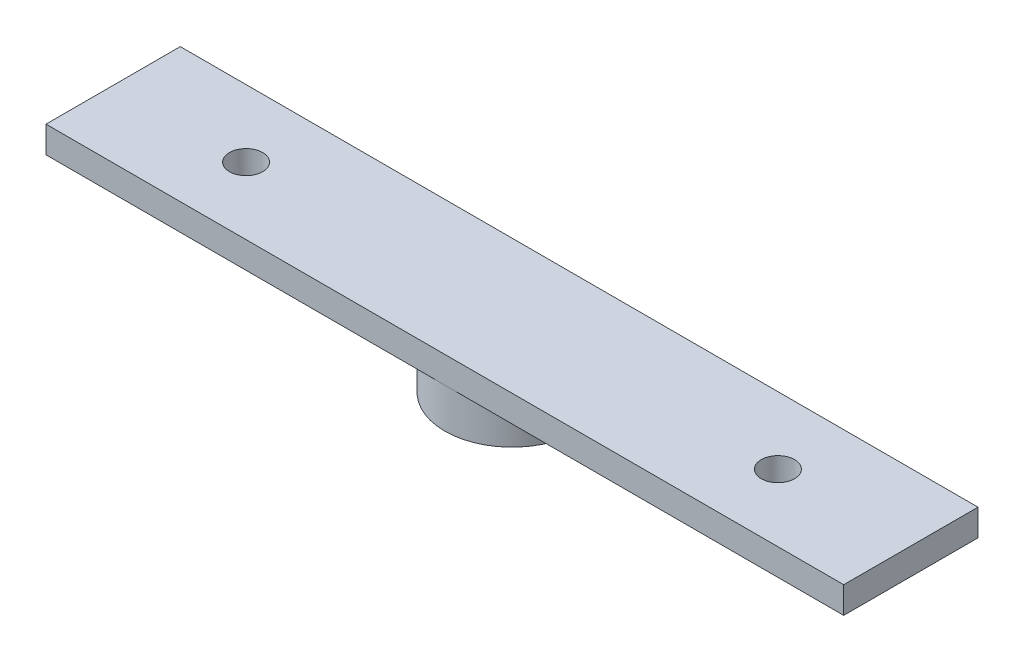
ISO-10303-21;
HEADER;
FILE_DESCRIPTION(('STEP AP214'),'2;1');
FILE_NAME('part.step','',(''),(''),'','','');
FILE_SCHEMA(('AUTOMOTIVE_DESIGN { 1 0 10303 214 1 1 1 1 }'));
ENDSEC;
DATA;
#1=APPLICATION_CONTEXT('core data for automotive mechanical design processes');
#2=APPLICATION_PROTOCOL_DEFINITION('international standard','automotive_design',2000,#1);
#3=PRODUCT_CONTEXT('',#1,'mechanical');
#4=PRODUCT('Part','Part','',(#3));
#5=PRODUCT_RELATED_PRODUCT_CATEGORY('part','',(#4));
#6=PRODUCT_DEFINITION_FORMATION('','',#4);
#7=PRODUCT_DEFINITION_CONTEXT('part definition',#1,'design');
#8=PRODUCT_DEFINITION('design','',#6,#7);
#9=PRODUCT_DEFINITION_SHAPE('','',#8);
#10=(LENGTH_UNIT() NAMED_UNIT(*) SI_UNIT(.MILLI.,.METRE.));
#11=(NAMED_UNIT(*) PLANE_ANGLE_UNIT() SI_UNIT($,.RADIAN.));
#12=(NAMED_UNIT(*) SI_UNIT($,.STERADIAN.) SOLID_ANGLE_UNIT());
#13=UNCERTAINTY_MEASURE_WITH_UNIT(LENGTH_MEASURE(1.E-05),#10,'distance_accuracy_value','');
#14=(GEOMETRIC_REPRESENTATION_CONTEXT(3) GLOBAL_UNCERTAINTY_ASSIGNED_CONTEXT((#13)) GLOBAL_UNIT_ASSIGNED_CONTEXT((#10,
#11,#12)) REPRESENTATION_CONTEXT('',''));
#15=CARTESIAN_POINT('',(0.,0.,0.));
#16=DIRECTION('',(0.,0.,1.));
#17=DIRECTION('',(1.,0.,0.));
#18=AXIS2_PLACEMENT_3D('',#15,#16,#17);
#19=CARTESIAN_POINT('',(5.05,0.,0.));
#20=DIRECTION('',(0.,1.,0.));
#21=DIRECTION('',(0.,0.,1.));
#22=AXIS2_PLACEMENT_3D('',#19,#20,#21);
#23=PLANE('',#22);
#24=CARTESIAN_POINT('',(0.,0.,0.));
#25=DIRECTION('',(0.,1.,0.));
#26=DIRECTION('',(0.,0.,1.));
#27=AXIS2_PLACEMENT_3D('',#24,#25,#26);
#28=CIRCLE('',#27,5.05);
#29=CARTESIAN_POINT('',(0.,0.,5.05));
#30=VERTEX_POINT('',#29);
#31=EDGE_CURVE('E109',#30,#30,#28,.T.);
#32=ORIENTED_EDGE('',*,*,#31,.F.);
#33=EDGE_LOOP('',(#32));
#34=FACE_BOUND('',#33,.T.);
#35=CARTESIAN_POINT('',(0.,0.,0.));
#36=DIRECTION('',(0.,1.,0.));
#37=DIRECTION('',(0.,0.,1.));
#38=AXIS2_PLACEMENT_3D('',#35,#36,#37);
#39=CIRCLE('',#38,3.05);
#40=CARTESIAN_POINT('',(0.,0.,3.05));
#41=VERTEX_POINT('',#40);
#42=EDGE_CURVE('E11',#41,#41,#39,.T.);
#43=ORIENTED_EDGE('',*,*,#42,.T.);
#44=EDGE_LOOP('',(#43));
#45=FACE_BOUND('',#44,.T.);
#46=ADVANCED_FACE('F37',(#34,#45),#23,.F.);
#47=CARTESIAN_POINT('',(0.,97.022326023357,0.));
#48=DIRECTION('',(0.,1.,0.));
#49=DIRECTION('',(0.,0.,1.));
#50=AXIS2_PLACEMENT_3D('',#47,#48,#49);
#51=CYLINDRICAL_SURFACE('',#50,3.05);
#52=ORIENTED_EDGE('',*,*,#42,.F.);
#53=EDGE_LOOP('',(#52));
#54=FACE_BOUND('',#53,.T.);
#55=CARTESIAN_POINT('',(0.,3.,0.));
#56=DIRECTION('',(0.,1.,0.));
#57=DIRECTION('',(0.,0.,1.));
#58=AXIS2_PLACEMENT_3D('',#55,#56,#57);
#59=CIRCLE('',#58,3.05);
#60=CARTESIAN_POINT('',(0.,3.,3.05));
#61=VERTEX_POINT('',#60);
#62=EDGE_CURVE('E106',#61,#61,#59,.T.);
#63=ORIENTED_EDGE('',*,*,#62,.T.);
#64=EDGE_LOOP('',(#63));
#65=FACE_BOUND('',#64,.T.);
#66=ADVANCED_FACE('F154',(#54,#65),#51,.F.);
#67=CARTESIAN_POINT('',(0.,97.022326023357,0.));
#68=DIRECTION('',(0.,1.,0.));
#69=DIRECTION('',(0.,0.,1.));
#70=AXIS2_PLACEMENT_3D('',#67,#68,#69);
#71=CYLINDRICAL_SURFACE('',#70,5.05);
#72=CARTESIAN_POINT('',(0.,3.,0.));
#73=DIRECTION('',(0.,1.,0.));
#74=DIRECTION('',(0.,0.,1.));
#75=AXIS2_PLACEMENT_3D('',#72,#73,#74);
#76=CIRCLE('',#75,5.05);
#77=CARTESIAN_POINT('',(0.,3.,5.05));
#78=VERTEX_POINT('',#77);
#79=CARTESIAN_POINT('',(0.,3.,-5.05));
#80=VERTEX_POINT('',#79);
#81=EDGE_CURVE('E45',#78,#80,#76,.T.);
#82=ORIENTED_EDGE('',*,*,#81,.F.);
#83=EDGE_CURVE('E51',#80,#78,#76,.T.);
#84=ORIENTED_EDGE('',*,*,#83,.F.);
#85=EDGE_LOOP('',(#82,#84));
#86=FACE_BOUND('',#85,.T.);
#87=ORIENTED_EDGE('',*,*,#31,.T.);
#88=EDGE_LOOP('',(#87));
#89=FACE_BOUND('',#88,.T.);
#90=ADVANCED_FACE('F159',(#86,#89),#71,.T.);
#91=CARTESIAN_POINT('',(0.,3.,0.));
#92=DIRECTION('',(0.,-1.,0.));
#93=DIRECTION('',(0.,0.,-1.));
#94=AXIS2_PLACEMENT_3D('',#91,#92,#93);
#95=PLANE('',#94);
#96=CARTESIAN_POINT('',(-20.,3.,0.));
#97=DIRECTION('',(0.,-1.,0.));
#98=DIRECTION('',(0.,0.,-1.));
#99=AXIS2_PLACEMENT_3D('',#96,#97,#98);
#100=CIRCLE('',#99,1.25);
#101=CARTESIAN_POINT('',(-20.,3.,-1.25));
#102=VERTEX_POINT('',#101);
#103=EDGE_CURVE('E141',#102,#102,#100,.T.);
#104=ORIENTED_EDGE('',*,*,#103,.F.);
#105=EDGE_LOOP('',(#104));
#106=FACE_BOUND('',#105,.T.);
#107=DIRECTION('',(-1.,0.,0.));
#108=VECTOR('',#107,1.);
#109=CARTESIAN_POINT('',(-30.,3.,-5.05));
#110=LINE('',#109,#108);
#111=CARTESIAN_POINT('',(-30.,3.,-5.05));
#112=VERTEX_POINT('',#111);
#113=EDGE_CURVE('E125',#80,#112,#110,.T.);
#114=ORIENTED_EDGE('',*,*,#113,.F.);
#115=ORIENTED_EDGE('',*,*,#83,.T.);
#116=DIRECTION('',(1.,0.,0.));
#117=VECTOR('',#116,1.);
#118=CARTESIAN_POINT('',(-30.,3.,5.05));
#119=LINE('',#118,#117);
#120=CARTESIAN_POINT('',(-30.,3.,5.05));
#121=VERTEX_POINT('',#120);
#122=EDGE_CURVE('E101',#121,#78,#119,.T.);
#123=ORIENTED_EDGE('',*,*,#122,.F.);
#124=DIRECTION('',(0.,0.,1.));
#125=VECTOR('',#124,1.);
#126=CARTESIAN_POINT('',(-30.,3.,5.05));
#127=LINE('',#126,#125);
#128=EDGE_CURVE('E129',#112,#121,#127,.T.);
#129=ORIENTED_EDGE('',*,*,#128,.F.);
#130=EDGE_LOOP('',(#114,#115,#123,#129));
#131=FACE_BOUND('',#130,.T.);
#132=ADVANCED_FACE('F122',(#106,#131),#95,.T.);
#133=CARTESIAN_POINT('',(0.,5.,0.));
#134=DIRECTION('',(0.,-1.,0.));
#135=DIRECTION('',(0.,0.,-1.));
#136=AXIS2_PLACEMENT_3D('',#133,#134,#135);
#137=PLANE('',#136);
#138=CARTESIAN_POINT('',(-20.,5.,0.));
#139=DIRECTION('',(0.,1.,0.));
#140=DIRECTION('',(0.,0.,1.));
#141=AXIS2_PLACEMENT_3D('',#138,#139,#140);
#142=CIRCLE('',#141,1.25);
#143=CARTESIAN_POINT('',(-20.,5.,1.25));
#144=VERTEX_POINT('',#143);
#145=EDGE_CURVE('E193',#144,#144,#142,.T.);
#146=ORIENTED_EDGE('',*,*,#145,.F.);
#147=EDGE_LOOP('',(#146));
#148=FACE_BOUND('',#147,.T.);
#149=CARTESIAN_POINT('',(20.,5.,0.));
#150=DIRECTION('',(0.,1.,0.));
#151=DIRECTION('',(0.,0.,-1.));
#152=AXIS2_PLACEMENT_3D('',#149,#150,#151);
#153=CIRCLE('',#152,1.25);
#154=CARTESIAN_POINT('',(20.,5.,-1.25));
#155=VERTEX_POINT('',#154);
#156=EDGE_CURVE('E195',#155,#155,#153,.T.);
#157=ORIENTED_EDGE('',*,*,#156,.F.);
#158=EDGE_LOOP('',(#157));
#159=FACE_BOUND('',#158,.T.);
#160=DIRECTION('',(0.,0.,-1.));
#161=VECTOR('',#160,1.);
#162=CARTESIAN_POINT('',(30.,5.,5.05));
#163=LINE('',#162,#161);
#164=CARTESIAN_POINT('',(30.,5.,5.05));
#165=VERTEX_POINT('',#164);
#166=CARTESIAN_POINT('',(30.,5.,-5.05));
#167=VERTEX_POINT('',#166);
#168=EDGE_CURVE('E92',#165,#167,#163,.T.);
#169=ORIENTED_EDGE('',*,*,#168,.T.);
#170=DIRECTION('',(-1.,0.,0.));
#171=VECTOR('',#170,1.);
#172=CARTESIAN_POINT('',(-30.,5.,-5.05));
#173=LINE('',#172,#171);
#174=CARTESIAN_POINT('',(-30.,5.,-5.05));
#175=VERTEX_POINT('',#174);
#176=EDGE_CURVE('E80',#167,#175,#173,.T.);
#177=ORIENTED_EDGE('',*,*,#176,.T.);
#178=DIRECTION('',(0.,0.,1.));
#179=VECTOR('',#178,1.);
#180=CARTESIAN_POINT('',(-30.,5.,5.05));
#181=LINE('',#180,#179);
#182=CARTESIAN_POINT('',(-30.,5.,5.05));
#183=VERTEX_POINT('',#182);
#184=EDGE_CURVE('E91',#175,#183,#181,.T.);
#185=ORIENTED_EDGE('',*,*,#184,.T.);
#186=DIRECTION('',(1.,0.,0.));
#187=VECTOR('',#186,1.);
#188=CARTESIAN_POINT('',(-30.,5.,5.05));
#189=LINE('',#188,#187);
#190=EDGE_CURVE('E97',#183,#165,#189,.T.);
#191=ORIENTED_EDGE('',*,*,#190,.T.);
#192=EDGE_LOOP('',(#169,#177,#185,#191));
#193=FACE_BOUND('',#192,.T.);
#194=ADVANCED_FACE('F95',(#148,#159,#193),#137,.F.);
#195=CARTESIAN_POINT('',(-30.,5.,5.05));
#196=DIRECTION('',(0.,0.,-1.));
#197=DIRECTION('',(-1.,0.,0.));
#198=AXIS2_PLACEMENT_3D('',#195,#196,#197);
#199=PLANE('',#198);
#200=ORIENTED_EDGE('',*,*,#122,.T.);
#201=CARTESIAN_POINT('',(30.,3.,5.05));
#202=VERTEX_POINT('',#201);
#203=EDGE_CURVE('E126',#78,#202,#119,.T.);
#204=ORIENTED_EDGE('',*,*,#203,.T.);
#205=DIRECTION('',(0.,-1.,0.));
#206=VECTOR('',#205,1.);
#207=CARTESIAN_POINT('',(30.,5.,5.05));
#208=LINE('',#207,#206);
#209=EDGE_CURVE('E137',#165,#202,#208,.T.);
#210=ORIENTED_EDGE('',*,*,#209,.F.);
#211=ORIENTED_EDGE('',*,*,#190,.F.);
#212=DIRECTION('',(0.,-1.,0.));
#213=VECTOR('',#212,1.);
#214=CARTESIAN_POINT('',(-30.,5.,5.05));
#215=LINE('',#214,#213);
#216=EDGE_CURVE('E111',#183,#121,#215,.T.);
#217=ORIENTED_EDGE('',*,*,#216,.T.);
#218=EDGE_LOOP('',(#200,#204,#210,#211,#217));
#219=FACE_BOUND('',#218,.T.);
#220=ADVANCED_FACE('F132',(#219),#199,.F.);
#221=CARTESIAN_POINT('',(-30.,5.,5.05));
#222=DIRECTION('',(1.,0.,0.));
#223=DIRECTION('',(0.,0.,-1.));
#224=AXIS2_PLACEMENT_3D('',#221,#222,#223);
#225=PLANE('',#224);
#226=ORIENTED_EDGE('',*,*,#128,.T.);
#227=ORIENTED_EDGE('',*,*,#216,.F.);
#228=ORIENTED_EDGE('',*,*,#184,.F.);
#229=DIRECTION('',(0.,-1.,0.));
#230=VECTOR('',#229,1.);
#231=CARTESIAN_POINT('',(-30.,5.,-5.05));
#232=LINE('',#231,#230);
#233=EDGE_CURVE('E88',#175,#112,#232,.T.);
#234=ORIENTED_EDGE('',*,*,#233,.T.);
#235=EDGE_LOOP('',(#226,#227,#228,#234));
#236=FACE_BOUND('',#235,.T.);
#237=ADVANCED_FACE('F144',(#236),#225,.F.);
#238=CARTESIAN_POINT('',(-30.,5.,-5.05));
#239=DIRECTION('',(0.,0.,1.));
#240=DIRECTION('',(1.,0.,0.));
#241=AXIS2_PLACEMENT_3D('',#238,#239,#240);
#242=PLANE('',#241);
#243=CARTESIAN_POINT('',(30.,3.,-5.05));
#244=VERTEX_POINT('',#243);
#245=EDGE_CURVE('E142',#244,#80,#110,.T.);
#246=ORIENTED_EDGE('',*,*,#245,.T.);
#247=ORIENTED_EDGE('',*,*,#113,.T.);
#248=ORIENTED_EDGE('',*,*,#233,.F.);
#249=ORIENTED_EDGE('',*,*,#176,.F.);
#250=DIRECTION('',(0.,-1.,0.));
#251=VECTOR('',#250,1.);
#252=CARTESIAN_POINT('',(30.,5.,-5.05));
#253=LINE('',#252,#251);
#254=EDGE_CURVE('E85',#167,#244,#253,.T.);
#255=ORIENTED_EDGE('',*,*,#254,.T.);
#256=EDGE_LOOP('',(#246,#247,#248,#249,#255));
#257=FACE_BOUND('',#256,.T.);
#258=ADVANCED_FACE('F83',(#257),#242,.F.);
#259=CARTESIAN_POINT('',(30.,5.,5.05));
#260=DIRECTION('',(-1.,0.,0.));
#261=DIRECTION('',(0.,0.,1.));
#262=AXIS2_PLACEMENT_3D('',#259,#260,#261);
#263=PLANE('',#262);
#264=DIRECTION('',(0.,0.,-1.));
#265=VECTOR('',#264,1.);
#266=CARTESIAN_POINT('',(30.,3.,5.05));
#267=LINE('',#266,#265);
#268=EDGE_CURVE('E105',#202,#244,#267,.T.);
#269=ORIENTED_EDGE('',*,*,#268,.T.);
#270=ORIENTED_EDGE('',*,*,#254,.F.);
#271=ORIENTED_EDGE('',*,*,#168,.F.);
#272=ORIENTED_EDGE('',*,*,#209,.T.);
#273=EDGE_LOOP('',(#269,#270,#271,#272));
#274=FACE_BOUND('',#273,.T.);
#275=ADVANCED_FACE('F103',(#274),#263,.F.);
#276=CARTESIAN_POINT('',(20.,3.,0.));
#277=DIRECTION('',(0.,-1.,0.));
#278=DIRECTION('',(0.,0.,-1.));
#279=AXIS2_PLACEMENT_3D('',#276,#277,#278);
#280=CIRCLE('',#279,1.25);
#281=CARTESIAN_POINT('',(20.,3.,-1.25));
#282=VERTEX_POINT('',#281);
#283=EDGE_CURVE('E40',#282,#282,#280,.T.);
#284=ORIENTED_EDGE('',*,*,#283,.F.);
#285=EDGE_LOOP('',(#284));
#286=FACE_BOUND('',#285,.T.);
#287=ORIENTED_EDGE('',*,*,#203,.F.);
#288=ORIENTED_EDGE('',*,*,#81,.T.);
#289=ORIENTED_EDGE('',*,*,#245,.F.);
#290=ORIENTED_EDGE('',*,*,#268,.F.);
#291=EDGE_LOOP('',(#287,#288,#289,#290));
#292=FACE_BOUND('',#291,.T.);
#293=ADVANCED_FACE('F127',(#286,#292),#95,.T.);
#294=ORIENTED_EDGE('',*,*,#62,.F.);
#295=EDGE_LOOP('',(#294));
#296=FACE_BOUND('',#295,.T.);
#297=ADVANCED_FACE('F167',(#296),#95,.T.);
#298=CARTESIAN_POINT('',(20.,0.,0.));
#299=DIRECTION('',(0.,1.,0.));
#300=DIRECTION('',(0.,0.,1.));
#301=AXIS2_PLACEMENT_3D('',#298,#299,#300);
#302=CYLINDRICAL_SURFACE('',#301,1.25);
#303=ORIENTED_EDGE('',*,*,#283,.T.);
#304=EDGE_LOOP('',(#303));
#305=FACE_BOUND('',#304,.T.);
#306=ORIENTED_EDGE('',*,*,#156,.T.);
#307=EDGE_LOOP('',(#306));
#308=FACE_BOUND('',#307,.T.);
#309=ADVANCED_FACE('F169',(#305,#308),#302,.F.);
#310=CARTESIAN_POINT('',(-20.,0.,0.));
#311=DIRECTION('',(0.,1.,0.));
#312=DIRECTION('',(0.,0.,1.));
#313=AXIS2_PLACEMENT_3D('',#310,#311,#312);
#314=CYLINDRICAL_SURFACE('',#313,1.25);
#315=ORIENTED_EDGE('',*,*,#103,.T.);
#316=EDGE_LOOP('',(#315));
#317=FACE_BOUND('',#316,.T.);
#318=ORIENTED_EDGE('',*,*,#145,.T.);
#319=EDGE_LOOP('',(#318));
#320=FACE_BOUND('',#319,.T.);
#321=ADVANCED_FACE('F175',(#317,#320),#314,.F.);
#322=CLOSED_SHELL('',(#46,#66,#90,#132,#194,#220,#237,#258,#275,#293,#297,#309,#321));
#323=MANIFOLD_SOLID_BREP('B2',#322);
#324=ADVANCED_BREP_SHAPE_REPRESENTATION('',(#18,#323),#14);
#325=SHAPE_DEFINITION_REPRESENTATION(#9,#324);
ENDSEC;
END-ISO-10303-21;
